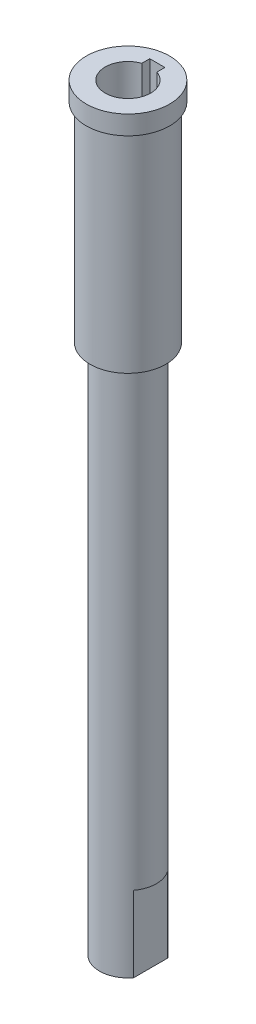
ISO-10303-21;
HEADER;
FILE_DESCRIPTION(('STEP AP214'),'2;1');
FILE_NAME('part.step','',(''),(''),'','','');
FILE_SCHEMA(('AUTOMOTIVE_DESIGN { 1 0 10303 214 1 1 1 1 }'));
ENDSEC;
DATA;
#1=APPLICATION_CONTEXT('core data for automotive mechanical design processes');
#2=APPLICATION_PROTOCOL_DEFINITION('international standard','automotive_design',2000,#1);
#3=PRODUCT_CONTEXT('',#1,'mechanical');
#4=PRODUCT('Part','Part','',(#3));
#5=PRODUCT_RELATED_PRODUCT_CATEGORY('part','',(#4));
#6=PRODUCT_DEFINITION_FORMATION('','',#4);
#7=PRODUCT_DEFINITION_CONTEXT('part definition',#1,'design');
#8=PRODUCT_DEFINITION('design','',#6,#7);
#9=PRODUCT_DEFINITION_SHAPE('','',#8);
#10=(LENGTH_UNIT() NAMED_UNIT(*) SI_UNIT(.MILLI.,.METRE.));
#11=(NAMED_UNIT(*) PLANE_ANGLE_UNIT() SI_UNIT($,.RADIAN.));
#12=(NAMED_UNIT(*) SI_UNIT($,.STERADIAN.) SOLID_ANGLE_UNIT());
#13=UNCERTAINTY_MEASURE_WITH_UNIT(LENGTH_MEASURE(1.E-05),#10,'distance_accuracy_value','');
#14=(GEOMETRIC_REPRESENTATION_CONTEXT(3) GLOBAL_UNCERTAINTY_ASSIGNED_CONTEXT((#13)) GLOBAL_UNIT_ASSIGNED_CONTEXT((#10,
#11,#12)) REPRESENTATION_CONTEXT('',''));
#15=CARTESIAN_POINT('',(0.,0.,0.));
#16=DIRECTION('',(0.,0.,1.));
#17=DIRECTION('',(1.,0.,0.));
#18=AXIS2_PLACEMENT_3D('',#15,#16,#17);
#19=CARTESIAN_POINT('',(0.,200.,0.));
#20=DIRECTION('',(0.,-1.,0.));
#21=DIRECTION('',(0.,0.,-1.));
#22=AXIS2_PLACEMENT_3D('',#19,#20,#21);
#23=CYLINDRICAL_SURFACE('',#22,10.);
#24=CARTESIAN_POINT('',(0.,140.,0.));
#25=DIRECTION('',(0.,-1.,0.));
#26=DIRECTION('',(0.,0.,-1.));
#27=AXIS2_PLACEMENT_3D('',#24,#25,#26);
#28=CIRCLE('',#27,10.);
#29=CARTESIAN_POINT('',(0.,140.,-10.));
#30=VERTEX_POINT('',#29);
#31=EDGE_CURVE('E110',#30,#30,#28,.T.);
#32=ORIENTED_EDGE('',*,*,#31,.F.);
#33=EDGE_LOOP('',(#32));
#34=FACE_BOUND('',#33,.T.);
#35=CARTESIAN_POINT('',(0.,195.,0.));
#36=DIRECTION('',(0.,1.,0.));
#37=DIRECTION('',(0.,0.,1.));
#38=AXIS2_PLACEMENT_3D('',#35,#36,#37);
#39=CIRCLE('',#38,10.);
#40=CARTESIAN_POINT('',(0.,195.,10.));
#41=VERTEX_POINT('',#40);
#42=EDGE_CURVE('E97',#41,#41,#39,.T.);
#43=ORIENTED_EDGE('',*,*,#42,.F.);
#44=EDGE_LOOP('',(#43));
#45=FACE_BOUND('',#44,.T.);
#46=ADVANCED_FACE('F41',(#34,#45),#23,.T.);
#47=CARTESIAN_POINT('',(0.,140.,0.));
#48=DIRECTION('',(0.,-1.,0.));
#49=DIRECTION('',(0.,0.,-1.));
#50=AXIS2_PLACEMENT_3D('',#47,#48,#49);
#51=PLANE('',#50);
#52=CARTESIAN_POINT('',(0.,140.,0.));
#53=DIRECTION('',(0.,-1.,0.));
#54=DIRECTION('',(0.,0.,-1.));
#55=AXIS2_PLACEMENT_3D('',#52,#53,#54);
#56=CIRCLE('',#55,7.5);
#57=CARTESIAN_POINT('',(0.,140.,-7.5));
#58=VERTEX_POINT('',#57);
#59=EDGE_CURVE('E106',#58,#58,#56,.T.);
#60=ORIENTED_EDGE('',*,*,#59,.F.);
#61=EDGE_LOOP('',(#60));
#62=FACE_BOUND('',#61,.T.);
#63=ORIENTED_EDGE('',*,*,#31,.T.);
#64=EDGE_LOOP('',(#63));
#65=FACE_BOUND('',#64,.T.);
#66=ADVANCED_FACE('F155',(#62,#65),#51,.T.);
#67=CARTESIAN_POINT('',(0.,140.,0.));
#68=DIRECTION('',(0.,-1.,0.));
#69=DIRECTION('',(0.,0.,-1.));
#70=AXIS2_PLACEMENT_3D('',#67,#68,#69);
#71=CYLINDRICAL_SURFACE('',#70,7.5);
#72=DIRECTION('',(0.,-1.,0.));
#73=VECTOR('',#72,1.);
#74=CARTESIAN_POINT('',(6.,140.,-4.5));
#75=LINE('',#74,#73);
#76=CARTESIAN_POINT('',(6.,0.,-4.5));
#77=VERTEX_POINT('',#76);
#78=CARTESIAN_POINT('',(6.,20.,-4.5));
#79=VERTEX_POINT('',#78);
#80=EDGE_CURVE('E92',#77,#79,#75,.F.);
#81=ORIENTED_EDGE('',*,*,#80,.F.);
#82=CARTESIAN_POINT('',(0.,0.,0.));
#83=DIRECTION('',(0.,-1.,0.));
#84=DIRECTION('',(0.,0.,-1.));
#85=AXIS2_PLACEMENT_3D('',#82,#83,#84);
#86=CIRCLE('',#85,7.5);
#87=CARTESIAN_POINT('',(6.,0.,4.5));
#88=VERTEX_POINT('',#87);
#89=EDGE_CURVE('E102',#88,#77,#86,.T.);
#90=ORIENTED_EDGE('',*,*,#89,.F.);
#91=DIRECTION('',(0.,-1.,0.));
#92=VECTOR('',#91,1.);
#93=CARTESIAN_POINT('',(6.,140.,4.5));
#94=LINE('',#93,#92);
#95=CARTESIAN_POINT('',(6.,20.,4.5));
#96=VERTEX_POINT('',#95);
#97=EDGE_CURVE('E55',#96,#88,#94,.T.);
#98=ORIENTED_EDGE('',*,*,#97,.F.);
#99=CARTESIAN_POINT('',(0.,20.,0.));
#100=DIRECTION('',(0.,1.,0.));
#101=DIRECTION('',(0.,0.,1.));
#102=AXIS2_PLACEMENT_3D('',#99,#100,#101);
#103=CIRCLE('',#102,7.5);
#104=EDGE_CURVE('E12',#79,#96,#103,.F.);
#105=ORIENTED_EDGE('',*,*,#104,.F.);
#106=EDGE_LOOP('',(#81,#90,#98,#105));
#107=FACE_BOUND('',#106,.T.);
#108=ORIENTED_EDGE('',*,*,#59,.T.);
#109=EDGE_LOOP('',(#108));
#110=FACE_BOUND('',#109,.T.);
#111=ADVANCED_FACE('F100',(#107,#110),#71,.T.);
#112=CARTESIAN_POINT('',(0.,0.,0.));
#113=DIRECTION('',(0.,1.,0.));
#114=DIRECTION('',(0.,0.,1.));
#115=AXIS2_PLACEMENT_3D('',#112,#113,#114);
#116=PLANE('',#115);
#117=ORIENTED_EDGE('',*,*,#89,.T.);
#118=DIRECTION('',(0.,0.,1.));
#119=VECTOR('',#118,1.);
#120=CARTESIAN_POINT('',(6.,0.,0.));
#121=LINE('',#120,#119);
#122=EDGE_CURVE('E48',#77,#88,#121,.T.);
#123=ORIENTED_EDGE('',*,*,#122,.T.);
#124=EDGE_LOOP('',(#117,#123));
#125=FACE_BOUND('',#124,.T.);
#126=ADVANCED_FACE('F105',(#125),#116,.F.);
#127=CARTESIAN_POINT('',(0.,195.,0.));
#128=DIRECTION('',(0.,1.,0.));
#129=DIRECTION('',(0.,0.,1.));
#130=AXIS2_PLACEMENT_3D('',#127,#128,#129);
#131=CYLINDRICAL_SURFACE('',#130,11.);
#132=CARTESIAN_POINT('',(0.,195.,0.));
#133=DIRECTION('',(0.,1.,0.));
#134=DIRECTION('',(0.,0.,1.));
#135=AXIS2_PLACEMENT_3D('',#132,#133,#134);
#136=CIRCLE('',#135,11.);
#137=CARTESIAN_POINT('',(0.,195.,11.));
#138=VERTEX_POINT('',#137);
#139=EDGE_CURVE('E107',#138,#138,#136,.T.);
#140=ORIENTED_EDGE('',*,*,#139,.T.);
#141=EDGE_LOOP('',(#140));
#142=FACE_BOUND('',#141,.T.);
#143=CARTESIAN_POINT('',(0.,200.,0.));
#144=DIRECTION('',(0.,1.,0.));
#145=DIRECTION('',(0.,0.,1.));
#146=AXIS2_PLACEMENT_3D('',#143,#144,#145);
#147=CIRCLE('',#146,11.);
#148=CARTESIAN_POINT('',(0.,200.,11.));
#149=VERTEX_POINT('',#148);
#150=EDGE_CURVE('E103',#149,#149,#147,.T.);
#151=ORIENTED_EDGE('',*,*,#150,.F.);
#152=EDGE_LOOP('',(#151));
#153=FACE_BOUND('',#152,.T.);
#154=ADVANCED_FACE('F194',(#142,#153),#131,.T.);
#155=CARTESIAN_POINT('',(0.,195.,0.));
#156=DIRECTION('',(0.,1.,0.));
#157=DIRECTION('',(0.,0.,1.));
#158=AXIS2_PLACEMENT_3D('',#155,#156,#157);
#159=PLANE('',#158);
#160=ORIENTED_EDGE('',*,*,#42,.T.);
#161=EDGE_LOOP('',(#160));
#162=FACE_BOUND('',#161,.T.);
#163=ORIENTED_EDGE('',*,*,#139,.F.);
#164=EDGE_LOOP('',(#163));
#165=FACE_BOUND('',#164,.T.);
#166=ADVANCED_FACE('F151',(#162,#165),#159,.F.);
#167=CARTESIAN_POINT('',(0.,170.,0.));
#168=DIRECTION('',(0.,1.,0.));
#169=DIRECTION('',(0.,0.,1.));
#170=AXIS2_PLACEMENT_3D('',#167,#168,#169);
#171=PLANE('',#170);
#172=DIRECTION('',(0.,0.,1.));
#173=VECTOR('',#172,1.);
#174=CARTESIAN_POINT('',(-2.,170.,-5.65685424949238));
#175=LINE('',#174,#173);
#176=CARTESIAN_POINT('',(-2.,170.,-7.74931739303482));
#177=VERTEX_POINT('',#176);
#178=CARTESIAN_POINT('',(-2.,170.,-5.65685424949238));
#179=VERTEX_POINT('',#178);
#180=EDGE_CURVE('E116',#177,#179,#175,.T.);
#181=ORIENTED_EDGE('',*,*,#180,.T.);
#182=CARTESIAN_POINT('',(0.,170.,0.));
#183=DIRECTION('',(0.,1.,0.));
#184=DIRECTION('',(0.,0.,1.));
#185=AXIS2_PLACEMENT_3D('',#182,#183,#184);
#186=CIRCLE('',#185,6.);
#187=CARTESIAN_POINT('',(2.,170.,-5.65685424949238));
#188=VERTEX_POINT('',#187);
#189=EDGE_CURVE('E119',#179,#188,#186,.T.);
#190=ORIENTED_EDGE('',*,*,#189,.T.);
#191=DIRECTION('',(0.,0.,-1.));
#192=VECTOR('',#191,1.);
#193=CARTESIAN_POINT('',(2.,170.,-5.65685424949238));
#194=LINE('',#193,#192);
#195=CARTESIAN_POINT('',(2.,170.,-7.74931739303482));
#196=VERTEX_POINT('',#195);
#197=EDGE_CURVE('E123',#188,#196,#194,.T.);
#198=ORIENTED_EDGE('',*,*,#197,.T.);
#199=DIRECTION('',(-1.,0.,0.));
#200=VECTOR('',#199,1.);
#201=CARTESIAN_POINT('',(2.,170.,-7.74931739303482));
#202=LINE('',#201,#200);
#203=EDGE_CURVE('E126',#196,#177,#202,.T.);
#204=ORIENTED_EDGE('',*,*,#203,.T.);
#205=EDGE_LOOP('',(#181,#190,#198,#204));
#206=FACE_BOUND('',#205,.T.);
#207=ADVANCED_FACE('F171',(#206),#171,.T.);
#208=CARTESIAN_POINT('',(0.,170.,0.));
#209=DIRECTION('',(0.,1.,0.));
#210=DIRECTION('',(0.,0.,1.));
#211=AXIS2_PLACEMENT_3D('',#208,#209,#210);
#212=CYLINDRICAL_SURFACE('',#211,6.);
#213=CARTESIAN_POINT('',(0.,200.,0.));
#214=DIRECTION('',(0.,1.,0.));
#215=DIRECTION('',(0.,0.,1.));
#216=AXIS2_PLACEMENT_3D('',#213,#214,#215);
#217=CIRCLE('',#216,6.);
#218=CARTESIAN_POINT('',(-2.,200.,-5.65685424949238));
#219=VERTEX_POINT('',#218);
#220=CARTESIAN_POINT('',(2.,200.,-5.65685424949238));
#221=VERTEX_POINT('',#220);
#222=EDGE_CURVE('E131',#219,#221,#217,.T.);
#223=ORIENTED_EDGE('',*,*,#222,.T.);
#224=DIRECTION('',(0.,1.,0.));
#225=VECTOR('',#224,1.);
#226=CARTESIAN_POINT('',(2.,170.,-5.65685424949238));
#227=LINE('',#226,#225);
#228=EDGE_CURVE('E143',#188,#221,#227,.T.);
#229=ORIENTED_EDGE('',*,*,#228,.F.);
#230=ORIENTED_EDGE('',*,*,#189,.F.);
#231=DIRECTION('',(0.,1.,0.));
#232=VECTOR('',#231,1.);
#233=CARTESIAN_POINT('',(-2.,170.,-5.65685424949238));
#234=LINE('',#233,#232);
#235=EDGE_CURVE('E129',#179,#219,#234,.T.);
#236=ORIENTED_EDGE('',*,*,#235,.T.);
#237=EDGE_LOOP('',(#223,#229,#230,#236));
#238=FACE_BOUND('',#237,.T.);
#239=ADVANCED_FACE('F174',(#238),#212,.F.);
#240=CARTESIAN_POINT('',(2.,170.,-5.65685424949238));
#241=DIRECTION('',(1.,0.,0.));
#242=DIRECTION('',(0.,0.,-1.));
#243=AXIS2_PLACEMENT_3D('',#240,#241,#242);
#244=PLANE('',#243);
#245=DIRECTION('',(0.,0.,-1.));
#246=VECTOR('',#245,1.);
#247=CARTESIAN_POINT('',(2.,200.,-5.65685424949238));
#248=LINE('',#247,#246);
#249=CARTESIAN_POINT('',(2.,200.,-7.74931739303482));
#250=VERTEX_POINT('',#249);
#251=EDGE_CURVE('E134',#221,#250,#248,.T.);
#252=ORIENTED_EDGE('',*,*,#251,.T.);
#253=DIRECTION('',(0.,1.,0.));
#254=VECTOR('',#253,1.);
#255=CARTESIAN_POINT('',(2.,170.,-7.74931739303482));
#256=LINE('',#255,#254);
#257=EDGE_CURVE('E141',#196,#250,#256,.T.);
#258=ORIENTED_EDGE('',*,*,#257,.F.);
#259=ORIENTED_EDGE('',*,*,#197,.F.);
#260=ORIENTED_EDGE('',*,*,#228,.T.);
#261=EDGE_LOOP('',(#252,#258,#259,#260));
#262=FACE_BOUND('',#261,.T.);
#263=ADVANCED_FACE('F180',(#262),#244,.F.);
#264=CARTESIAN_POINT('',(2.,170.,-7.74931739303482));
#265=DIRECTION('',(0.,0.,-1.));
#266=DIRECTION('',(-1.,0.,0.));
#267=AXIS2_PLACEMENT_3D('',#264,#265,#266);
#268=PLANE('',#267);
#269=DIRECTION('',(-1.,0.,0.));
#270=VECTOR('',#269,1.);
#271=CARTESIAN_POINT('',(2.,200.,-7.74931739303482));
#272=LINE('',#271,#270);
#273=CARTESIAN_POINT('',(-2.,200.,-7.74931739303482));
#274=VERTEX_POINT('',#273);
#275=EDGE_CURVE('E120',#250,#274,#272,.T.);
#276=ORIENTED_EDGE('',*,*,#275,.T.);
#277=DIRECTION('',(0.,1.,0.));
#278=VECTOR('',#277,1.);
#279=CARTESIAN_POINT('',(-2.,170.,-7.74931739303482));
#280=LINE('',#279,#278);
#281=EDGE_CURVE('E139',#177,#274,#280,.T.);
#282=ORIENTED_EDGE('',*,*,#281,.F.);
#283=ORIENTED_EDGE('',*,*,#203,.F.);
#284=ORIENTED_EDGE('',*,*,#257,.T.);
#285=EDGE_LOOP('',(#276,#282,#283,#284));
#286=FACE_BOUND('',#285,.T.);
#287=ADVANCED_FACE('F176',(#286),#268,.F.);
#288=CARTESIAN_POINT('',(-2.,170.,-5.65685424949238));
#289=DIRECTION('',(-1.,0.,0.));
#290=DIRECTION('',(0.,0.,1.));
#291=AXIS2_PLACEMENT_3D('',#288,#289,#290);
#292=PLANE('',#291);
#293=DIRECTION('',(0.,0.,1.));
#294=VECTOR('',#293,1.);
#295=CARTESIAN_POINT('',(-2.,200.,-5.65685424949238));
#296=LINE('',#295,#294);
#297=EDGE_CURVE('E63',#274,#219,#296,.T.);
#298=ORIENTED_EDGE('',*,*,#297,.T.);
#299=ORIENTED_EDGE('',*,*,#235,.F.);
#300=ORIENTED_EDGE('',*,*,#180,.F.);
#301=ORIENTED_EDGE('',*,*,#281,.T.);
#302=EDGE_LOOP('',(#298,#299,#300,#301));
#303=FACE_BOUND('',#302,.T.);
#304=ADVANCED_FACE('F179',(#303),#292,.F.);
#305=CARTESIAN_POINT('',(0.,200.,0.));
#306=DIRECTION('',(0.,1.,0.));
#307=DIRECTION('',(0.,0.,1.));
#308=AXIS2_PLACEMENT_3D('',#305,#306,#307);
#309=PLANE('',#308);
#310=ORIENTED_EDGE('',*,*,#297,.F.);
#311=ORIENTED_EDGE('',*,*,#275,.F.);
#312=ORIENTED_EDGE('',*,*,#251,.F.);
#313=ORIENTED_EDGE('',*,*,#222,.F.);
#314=EDGE_LOOP('',(#310,#311,#312,#313));
#315=FACE_BOUND('',#314,.T.);
#316=ORIENTED_EDGE('',*,*,#150,.T.);
#317=EDGE_LOOP('',(#316));
#318=FACE_BOUND('',#317,.T.);
#319=ADVANCED_FACE('F190',(#315,#318),#309,.T.);
#320=CARTESIAN_POINT('',(6.,20.,23.4714496267777));
#321=DIRECTION('',(-1.,0.,0.));
#322=DIRECTION('',(0.,0.,1.));
#323=AXIS2_PLACEMENT_3D('',#320,#321,#322);
#324=PLANE('',#323);
#325=ORIENTED_EDGE('',*,*,#80,.T.);
#326=DIRECTION('',(0.,0.,-1.));
#327=VECTOR('',#326,1.);
#328=CARTESIAN_POINT('',(6.,20.,23.4714496267777));
#329=LINE('',#328,#327);
#330=EDGE_CURVE('E212',#96,#79,#329,.T.);
#331=ORIENTED_EDGE('',*,*,#330,.F.);
#332=ORIENTED_EDGE('',*,*,#97,.T.);
#333=ORIENTED_EDGE('',*,*,#122,.F.);
#334=EDGE_LOOP('',(#325,#331,#332,#333));
#335=FACE_BOUND('',#334,.T.);
#336=ADVANCED_FACE('F91',(#335),#324,.F.);
#337=CARTESIAN_POINT('',(0.,20.,0.));
#338=DIRECTION('',(0.,1.,0.));
#339=DIRECTION('',(0.,0.,1.));
#340=AXIS2_PLACEMENT_3D('',#337,#338,#339);
#341=PLANE('',#340);
#342=ORIENTED_EDGE('',*,*,#104,.T.);
#343=ORIENTED_EDGE('',*,*,#330,.T.);
#344=EDGE_LOOP('',(#342,#343));
#345=FACE_BOUND('',#344,.T.);
#346=ADVANCED_FACE('F207',(#345),#341,.F.);
#347=CLOSED_SHELL('',(#46,#66,#111,#126,#154,#166,#207,#239,#263,#287,#304,#319,#336,#346));
#348=MANIFOLD_SOLID_BREP('B2',#347);
#349=ADVANCED_BREP_SHAPE_REPRESENTATION('',(#18,#348),#14);
#350=SHAPE_DEFINITION_REPRESENTATION(#9,#349);
ENDSEC;
END-ISO-10303-21;
